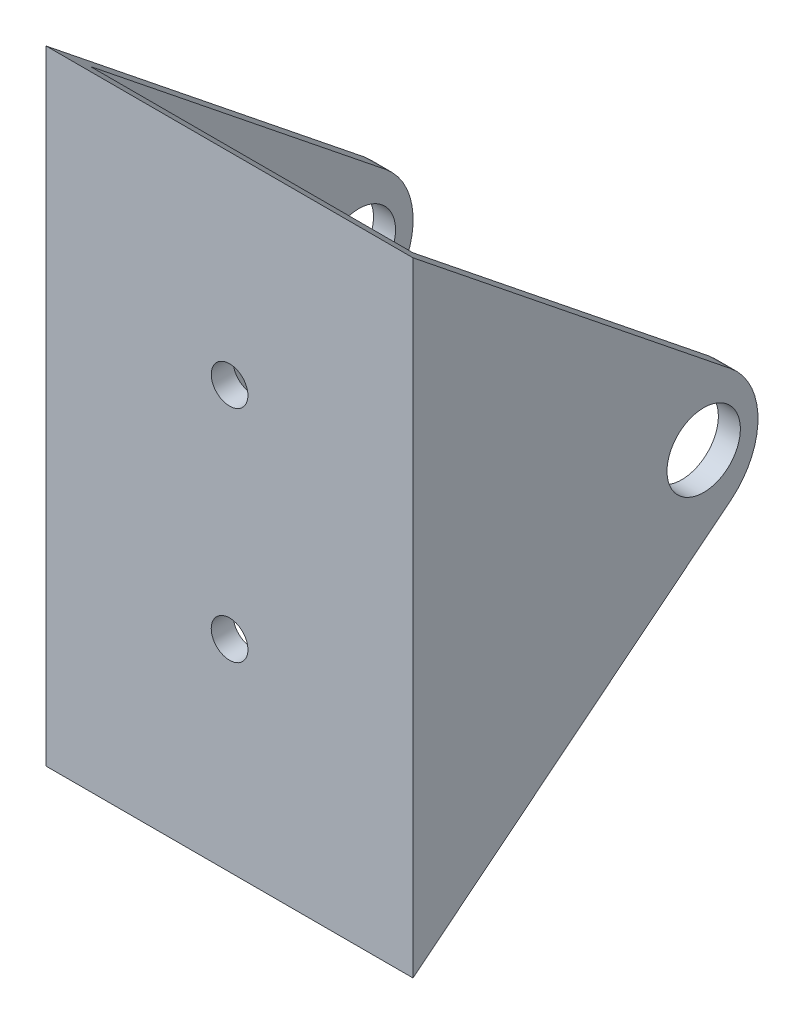
ISO-10303-21;
HEADER;
FILE_DESCRIPTION(('STEP AP214'),'2;1');
FILE_NAME('part.step','',(''),(''),'','','');
FILE_SCHEMA(('AUTOMOTIVE_DESIGN { 1 0 10303 214 1 1 1 1 }'));
ENDSEC;
DATA;
#1=APPLICATION_CONTEXT('core data for automotive mechanical design processes');
#2=APPLICATION_PROTOCOL_DEFINITION('international standard','automotive_design',2000,#1);
#3=PRODUCT_CONTEXT('',#1,'mechanical');
#4=PRODUCT('Part','Part','',(#3));
#5=PRODUCT_RELATED_PRODUCT_CATEGORY('part','',(#4));
#6=PRODUCT_DEFINITION_FORMATION('','',#4);
#7=PRODUCT_DEFINITION_CONTEXT('part definition',#1,'design');
#8=PRODUCT_DEFINITION('design','',#6,#7);
#9=PRODUCT_DEFINITION_SHAPE('','',#8);
#10=(LENGTH_UNIT() NAMED_UNIT(*) SI_UNIT(.MILLI.,.METRE.));
#11=(NAMED_UNIT(*) PLANE_ANGLE_UNIT() SI_UNIT($,.RADIAN.));
#12=(NAMED_UNIT(*) SI_UNIT($,.STERADIAN.) SOLID_ANGLE_UNIT());
#13=UNCERTAINTY_MEASURE_WITH_UNIT(LENGTH_MEASURE(1.E-05),#10,'distance_accuracy_value','');
#14=(GEOMETRIC_REPRESENTATION_CONTEXT(3) GLOBAL_UNCERTAINTY_ASSIGNED_CONTEXT((#13)) GLOBAL_UNIT_ASSIGNED_CONTEXT((#10,
#11,#12)) REPRESENTATION_CONTEXT('',''));
#15=CARTESIAN_POINT('',(0.,0.,0.));
#16=DIRECTION('',(0.,0.,1.));
#17=DIRECTION('',(1.,0.,0.));
#18=AXIS2_PLACEMENT_3D('',#15,#16,#17);
#19=CARTESIAN_POINT('',(0.,0.,0.));
#20=DIRECTION('',(0.,0.,1.));
#21=DIRECTION('',(1.,0.,0.));
#22=AXIS2_PLACEMENT_3D('',#19,#20,#21);
#23=PLANE('',#22);
#24=CARTESIAN_POINT('',(0.,15.,0.));
#25=DIRECTION('',(0.,0.,1.));
#26=DIRECTION('',(1.,0.,0.));
#27=AXIS2_PLACEMENT_3D('',#24,#25,#26);
#28=CIRCLE('',#27,2.5);
#29=CARTESIAN_POINT('',(2.5,15.,0.));
#30=VERTEX_POINT('',#29);
#31=EDGE_CURVE('E214',#30,#30,#28,.T.);
#32=ORIENTED_EDGE('',*,*,#31,.T.);
#33=EDGE_LOOP('',(#32));
#34=FACE_BOUND('',#33,.T.);
#35=CARTESIAN_POINT('',(0.,-15.,0.));
#36=DIRECTION('',(0.,0.,1.));
#37=DIRECTION('',(1.,0.,0.));
#38=AXIS2_PLACEMENT_3D('',#35,#36,#37);
#39=CIRCLE('',#38,2.5);
#40=CARTESIAN_POINT('',(2.50000000000001,-15.,0.));
#41=VERTEX_POINT('',#40);
#42=EDGE_CURVE('E219',#41,#41,#39,.T.);
#43=ORIENTED_EDGE('',*,*,#42,.T.);
#44=EDGE_LOOP('',(#43));
#45=FACE_BOUND('',#44,.T.);
#46=DIRECTION('',(-1.,0.,0.));
#47=VECTOR('',#46,1.);
#48=CARTESIAN_POINT('',(0.,40.0943396226415,0.));
#49=LINE('',#48,#47);
#50=CARTESIAN_POINT('',(22.,40.0943396226415,0.));
#51=VERTEX_POINT('',#50);
#52=CARTESIAN_POINT('',(-22.,40.0943396226415,0.));
#53=VERTEX_POINT('',#52);
#54=EDGE_CURVE('E174',#51,#53,#49,.T.);
#55=ORIENTED_EDGE('',*,*,#54,.F.);
#56=DIRECTION('',(0.,1.,0.));
#57=VECTOR('',#56,1.);
#58=CARTESIAN_POINT('',(22.,-42.5,0.));
#59=LINE('',#58,#57);
#60=CARTESIAN_POINT('',(22.,-40.0943396226415,0.));
#61=VERTEX_POINT('',#60);
#62=EDGE_CURVE('E190',#61,#51,#59,.T.);
#63=ORIENTED_EDGE('',*,*,#62,.F.);
#64=DIRECTION('',(1.,0.,0.));
#65=VECTOR('',#64,1.);
#66=CARTESIAN_POINT('',(0.,-40.0943396226415,0.));
#67=LINE('',#66,#65);
#68=CARTESIAN_POINT('',(-22.,-40.0943396226415,0.));
#69=VERTEX_POINT('',#68);
#70=EDGE_CURVE('E183',#69,#61,#67,.T.);
#71=ORIENTED_EDGE('',*,*,#70,.F.);
#72=DIRECTION('',(0.,-1.,0.));
#73=VECTOR('',#72,1.);
#74=CARTESIAN_POINT('',(-22.,42.5,0.));
#75=LINE('',#74,#73);
#76=EDGE_CURVE('E188',#53,#69,#75,.T.);
#77=ORIENTED_EDGE('',*,*,#76,.F.);
#78=EDGE_LOOP('',(#55,#63,#71,#77));
#79=FACE_BOUND('',#78,.T.);
#80=ADVANCED_FACE('F55',(#34,#45,#79),#23,.F.);
#81=CARTESIAN_POINT('',(25.,42.5,3.));
#82=DIRECTION('',(-1.,0.,0.));
#83=DIRECTION('',(0.,-1.,0.));
#84=AXIS2_PLACEMENT_3D('',#81,#82,#83);
#85=PLANE('',#84);
#86=CARTESIAN_POINT('',(25.,0.,-36.6147540574796));
#87=DIRECTION('',(1.,0.,0.));
#88=DIRECTION('',(0.,1.,0.));
#89=AXIS2_PLACEMENT_3D('',#86,#87,#88);
#90=CIRCLE('',#89,5.);
#91=CARTESIAN_POINT('',(25.,5.,-36.6147540574796));
#92=VERTEX_POINT('',#91);
#93=EDGE_CURVE('E211',#92,#92,#90,.T.);
#94=ORIENTED_EDGE('',*,*,#93,.F.);
#95=EDGE_LOOP('',(#94));
#96=FACE_BOUND('',#95,.T.);
#97=DIRECTION('',(0.,0.625592184650773,-0.780150253799788));
#98=VECTOR('',#97,1.);
#99=CARTESIAN_POINT('',(25.,-24.4027950815232,-19.5682790748063));
#100=LINE('',#99,#98);
#101=CARTESIAN_POINT('',(25.,-42.5,3.));
#102=VERTEX_POINT('',#101);
#103=CARTESIAN_POINT('',(25.,-7.80150253799787,-40.2710674232027));
#104=VERTEX_POINT('',#103);
#105=EDGE_CURVE('E165',#102,#104,#100,.T.);
#106=ORIENTED_EDGE('',*,*,#105,.T.);
#107=CARTESIAN_POINT('',(25.,0.,-34.0151455766949));
#108=DIRECTION('',(-1.,0.,0.));
#109=DIRECTION('',(0.,-1.,0.));
#110=AXIS2_PLACEMENT_3D('',#107,#108,#109);
#111=CIRCLE('',#110,10.);
#112=CARTESIAN_POINT('',(25.,7.80150253799787,-40.2710674232027));
#113=VERTEX_POINT('',#112);
#114=EDGE_CURVE('E64',#104,#113,#111,.F.);
#115=ORIENTED_EDGE('',*,*,#114,.T.);
#116=DIRECTION('',(0.,0.625592184650773,0.780150253799788));
#117=VECTOR('',#116,1.);
#118=CARTESIAN_POINT('',(25.,24.4027950815232,-19.5682790748063));
#119=LINE('',#118,#117);
#120=CARTESIAN_POINT('',(25.,42.5,3.));
#121=VERTEX_POINT('',#120);
#122=EDGE_CURVE('E127',#113,#121,#119,.T.);
#123=ORIENTED_EDGE('',*,*,#122,.T.);
#124=DIRECTION('',(0.,1.,0.));
#125=VECTOR('',#124,1.);
#126=CARTESIAN_POINT('',(25.,42.5,3.));
#127=LINE('',#126,#125);
#128=EDGE_CURVE('E135',#102,#121,#127,.T.);
#129=ORIENTED_EDGE('',*,*,#128,.F.);
#130=EDGE_LOOP('',(#106,#115,#123,#129));
#131=FACE_BOUND('',#130,.T.);
#132=ADVANCED_FACE('F245',(#96,#131),#85,.F.);
#133=CARTESIAN_POINT('',(-25.,42.5,3.));
#134=DIRECTION('',(1.,0.,0.));
#135=DIRECTION('',(0.,1.,0.));
#136=AXIS2_PLACEMENT_3D('',#133,#134,#135);
#137=PLANE('',#136);
#138=CARTESIAN_POINT('',(-25.,0.,-36.6147540574796));
#139=DIRECTION('',(1.,0.,0.));
#140=DIRECTION('',(0.,1.,0.));
#141=AXIS2_PLACEMENT_3D('',#138,#139,#140);
#142=CIRCLE('',#141,5.);
#143=CARTESIAN_POINT('',(-25.,4.99999999999999,-36.6147540574796));
#144=VERTEX_POINT('',#143);
#145=EDGE_CURVE('E209',#144,#144,#142,.T.);
#146=ORIENTED_EDGE('',*,*,#145,.T.);
#147=EDGE_LOOP('',(#146));
#148=FACE_BOUND('',#147,.T.);
#149=DIRECTION('',(0.,0.625592184650773,0.780150253799788));
#150=VECTOR('',#149,1.);
#151=CARTESIAN_POINT('',(-25.,24.4027950815232,-19.5682790748063));
#152=LINE('',#151,#150);
#153=CARTESIAN_POINT('',(-25.,7.80150253799787,-40.2710674232027));
#154=VERTEX_POINT('',#153);
#155=CARTESIAN_POINT('',(-25.,42.5,3.));
#156=VERTEX_POINT('',#155);
#157=EDGE_CURVE('E118',#154,#156,#152,.T.);
#158=ORIENTED_EDGE('',*,*,#157,.F.);
#159=CARTESIAN_POINT('',(-25.,0.,-34.0151455766949));
#160=DIRECTION('',(1.,0.,0.));
#161=DIRECTION('',(0.,1.,0.));
#162=AXIS2_PLACEMENT_3D('',#159,#160,#161);
#163=CIRCLE('',#162,10.);
#164=CARTESIAN_POINT('',(-25.,-7.80150253799787,-40.2710674232027));
#165=VERTEX_POINT('',#164);
#166=EDGE_CURVE('E157',#154,#165,#163,.F.);
#167=ORIENTED_EDGE('',*,*,#166,.T.);
#168=DIRECTION('',(0.,0.625592184650773,-0.780150253799788));
#169=VECTOR('',#168,1.);
#170=CARTESIAN_POINT('',(-25.,-24.4027950815232,-19.5682790748063));
#171=LINE('',#170,#169);
#172=CARTESIAN_POINT('',(-25.,-42.5,3.));
#173=VERTEX_POINT('',#172);
#174=EDGE_CURVE('E140',#173,#165,#171,.T.);
#175=ORIENTED_EDGE('',*,*,#174,.F.);
#176=DIRECTION('',(0.,-1.,0.));
#177=VECTOR('',#176,1.);
#178=CARTESIAN_POINT('',(-25.,42.5,3.));
#179=LINE('',#178,#177);
#180=EDGE_CURVE('E133',#156,#173,#179,.T.);
#181=ORIENTED_EDGE('',*,*,#180,.F.);
#182=EDGE_LOOP('',(#158,#167,#175,#181));
#183=FACE_BOUND('',#182,.T.);
#184=ADVANCED_FACE('F138',(#148,#183),#137,.F.);
#185=CARTESIAN_POINT('',(22.,-42.5,-50.));
#186=DIRECTION('',(1.,0.,0.));
#187=DIRECTION('',(0.,1.,0.));
#188=AXIS2_PLACEMENT_3D('',#185,#186,#187);
#189=PLANE('',#188);
#190=CARTESIAN_POINT('',(22.,0.,-36.6147540574796));
#191=DIRECTION('',(1.,0.,0.));
#192=DIRECTION('',(0.,1.,0.));
#193=AXIS2_PLACEMENT_3D('',#190,#191,#192);
#194=CIRCLE('',#193,5.);
#195=CARTESIAN_POINT('',(22.,5.,-36.6147540574796));
#196=VERTEX_POINT('',#195);
#197=EDGE_CURVE('E203',#196,#196,#194,.T.);
#198=ORIENTED_EDGE('',*,*,#197,.T.);
#199=EDGE_LOOP('',(#198));
#200=FACE_BOUND('',#199,.T.);
#201=DIRECTION('',(0.,0.625592184650773,0.780150253799788));
#202=VECTOR('',#201,1.);
#203=CARTESIAN_POINT('',(22.,-16.6330372135854,-70.7423758192947));
#204=LINE('',#203,#202);
#205=CARTESIAN_POINT('',(22.,7.80150253799788,-40.2710674232027));
#206=VERTEX_POINT('',#205);
#207=EDGE_CURVE('E176',#206,#51,#204,.T.);
#208=ORIENTED_EDGE('',*,*,#207,.F.);
#209=CARTESIAN_POINT('',(22.,0.,-34.0151455766949));
#210=DIRECTION('',(1.,0.,0.));
#211=DIRECTION('',(0.,1.,0.));
#212=AXIS2_PLACEMENT_3D('',#209,#210,#211);
#213=CIRCLE('',#212,10.);
#214=CARTESIAN_POINT('',(22.,-7.80150253799787,-40.2710674232027));
#215=VERTEX_POINT('',#214);
#216=EDGE_CURVE('E12',#206,#215,#213,.F.);
#217=ORIENTED_EDGE('',*,*,#216,.T.);
#218=DIRECTION('',(0.,0.625592184650773,-0.780150253799788));
#219=VECTOR('',#218,1.);
#220=CARTESIAN_POINT('',(22.,-16.6330372135854,-29.2576241807053));
#221=LINE('',#220,#219);
#222=EDGE_CURVE('E185',#61,#215,#221,.T.);
#223=ORIENTED_EDGE('',*,*,#222,.F.);
#224=ORIENTED_EDGE('',*,*,#62,.T.);
#225=EDGE_LOOP('',(#208,#217,#223,#224));
#226=FACE_BOUND('',#225,.T.);
#227=ADVANCED_FACE('F196',(#200,#226),#189,.F.);
#228=CARTESIAN_POINT('',(-22.,42.5,-50.));
#229=DIRECTION('',(-1.,0.,0.));
#230=DIRECTION('',(0.,-1.,0.));
#231=AXIS2_PLACEMENT_3D('',#228,#229,#230);
#232=PLANE('',#231);
#233=CARTESIAN_POINT('',(-22.,0.,-36.6147540574796));
#234=DIRECTION('',(-1.,0.,0.));
#235=DIRECTION('',(0.,-1.,0.));
#236=AXIS2_PLACEMENT_3D('',#233,#234,#235);
#237=CIRCLE('',#236,5.);
#238=CARTESIAN_POINT('',(-22.,-5.,-36.6147540574796));
#239=VERTEX_POINT('',#238);
#240=EDGE_CURVE('E59',#239,#239,#237,.T.);
#241=ORIENTED_EDGE('',*,*,#240,.T.);
#242=EDGE_LOOP('',(#241));
#243=FACE_BOUND('',#242,.T.);
#244=DIRECTION('',(0.,-0.625592184650773,0.780150253799788));
#245=VECTOR('',#244,1.);
#246=CARTESIAN_POINT('',(-22.,16.6330372135854,-70.7423758192947));
#247=LINE('',#246,#245);
#248=CARTESIAN_POINT('',(-22.,-7.80150253799788,-40.2710674232026));
#249=VERTEX_POINT('',#248);
#250=EDGE_CURVE('E164',#249,#69,#247,.T.);
#251=ORIENTED_EDGE('',*,*,#250,.F.);
#252=CARTESIAN_POINT('',(-22.,0.,-34.0151455766949));
#253=DIRECTION('',(-1.,0.,0.));
#254=DIRECTION('',(0.,-1.,0.));
#255=AXIS2_PLACEMENT_3D('',#252,#253,#254);
#256=CIRCLE('',#255,10.);
#257=CARTESIAN_POINT('',(-22.,7.80150253799787,-40.2710674232027));
#258=VERTEX_POINT('',#257);
#259=EDGE_CURVE('E152',#249,#258,#256,.F.);
#260=ORIENTED_EDGE('',*,*,#259,.T.);
#261=DIRECTION('',(0.,-0.625592184650773,-0.780150253799788));
#262=VECTOR('',#261,1.);
#263=CARTESIAN_POINT('',(-22.,16.6330372135854,-29.2576241807053));
#264=LINE('',#263,#262);
#265=EDGE_CURVE('E126',#53,#258,#264,.T.);
#266=ORIENTED_EDGE('',*,*,#265,.F.);
#267=ORIENTED_EDGE('',*,*,#76,.T.);
#268=EDGE_LOOP('',(#251,#260,#266,#267));
#269=FACE_BOUND('',#268,.T.);
#270=ADVANCED_FACE('F170',(#243,#269),#232,.F.);
#271=CARTESIAN_POINT('',(0.,0.,3.));
#272=DIRECTION('',(0.,0.,1.));
#273=DIRECTION('',(1.,0.,0.));
#274=AXIS2_PLACEMENT_3D('',#271,#272,#273);
#275=PLANE('',#274);
#276=CARTESIAN_POINT('',(0.,15.,3.));
#277=DIRECTION('',(0.,0.,1.));
#278=DIRECTION('',(1.,0.,0.));
#279=AXIS2_PLACEMENT_3D('',#276,#277,#278);
#280=CIRCLE('',#279,2.5);
#281=CARTESIAN_POINT('',(2.5,15.,3.));
#282=VERTEX_POINT('',#281);
#283=EDGE_CURVE('E222',#282,#282,#280,.T.);
#284=ORIENTED_EDGE('',*,*,#283,.F.);
#285=EDGE_LOOP('',(#284));
#286=FACE_BOUND('',#285,.T.);
#287=CARTESIAN_POINT('',(0.,-15.,3.));
#288=DIRECTION('',(0.,0.,1.));
#289=DIRECTION('',(-1.,0.,0.));
#290=AXIS2_PLACEMENT_3D('',#287,#288,#289);
#291=CIRCLE('',#290,2.5);
#292=CARTESIAN_POINT('',(-2.49999999999999,-15.,3.));
#293=VERTEX_POINT('',#292);
#294=EDGE_CURVE('E223',#293,#293,#291,.T.);
#295=ORIENTED_EDGE('',*,*,#294,.F.);
#296=EDGE_LOOP('',(#295));
#297=FACE_BOUND('',#296,.T.);
#298=ORIENTED_EDGE('',*,*,#128,.T.);
#299=DIRECTION('',(-1.,0.,0.));
#300=VECTOR('',#299,1.);
#301=CARTESIAN_POINT('',(-25.,42.5,3.));
#302=LINE('',#301,#300);
#303=EDGE_CURVE('E121',#121,#156,#302,.T.);
#304=ORIENTED_EDGE('',*,*,#303,.T.);
#305=ORIENTED_EDGE('',*,*,#180,.T.);
#306=DIRECTION('',(1.,0.,0.));
#307=VECTOR('',#306,1.);
#308=CARTESIAN_POINT('',(-25.,-42.5,3.));
#309=LINE('',#308,#307);
#310=EDGE_CURVE('E141',#173,#102,#309,.T.);
#311=ORIENTED_EDGE('',*,*,#310,.T.);
#312=EDGE_LOOP('',(#298,#304,#305,#311));
#313=FACE_BOUND('',#312,.T.);
#314=ADVANCED_FACE('F131',(#286,#297,#313),#275,.T.);
#315=CARTESIAN_POINT('',(-25.,-24.4027950815232,-19.5682790748063));
#316=DIRECTION('',(0.,-0.780150253799788,-0.625592184650773));
#317=DIRECTION('',(0.,0.625592184650773,-0.780150253799788));
#318=AXIS2_PLACEMENT_3D('',#315,#316,#317);
#319=PLANE('',#318);
#320=ORIENTED_EDGE('',*,*,#174,.T.);
#321=DIRECTION('',(1.,0.,0.));
#322=VECTOR('',#321,1.);
#323=CARTESIAN_POINT('',(-25.,-7.80150253799788,-40.2710674232026));
#324=LINE('',#323,#322);
#325=EDGE_CURVE('E149',#165,#249,#324,.T.);
#326=ORIENTED_EDGE('',*,*,#325,.T.);
#327=ORIENTED_EDGE('',*,*,#250,.T.);
#328=ORIENTED_EDGE('',*,*,#70,.T.);
#329=ORIENTED_EDGE('',*,*,#222,.T.);
#330=DIRECTION('',(1.,0.,0.));
#331=VECTOR('',#330,1.);
#332=CARTESIAN_POINT('',(-25.,-7.80150253799788,-40.2710674232026));
#333=LINE('',#332,#331);
#334=EDGE_CURVE('E143',#215,#104,#333,.T.);
#335=ORIENTED_EDGE('',*,*,#334,.T.);
#336=ORIENTED_EDGE('',*,*,#105,.F.);
#337=ORIENTED_EDGE('',*,*,#310,.F.);
#338=EDGE_LOOP('',(#320,#326,#327,#328,#329,#335,#336,#337));
#339=FACE_BOUND('',#338,.T.);
#340=ADVANCED_FACE('F162',(#339),#319,.T.);
#341=CARTESIAN_POINT('',(-25.,24.4027950815232,-19.5682790748063));
#342=DIRECTION('',(0.,0.780150253799788,-0.625592184650773));
#343=DIRECTION('',(0.,0.625592184650773,0.780150253799788));
#344=AXIS2_PLACEMENT_3D('',#341,#342,#343);
#345=PLANE('',#344);
#346=ORIENTED_EDGE('',*,*,#265,.T.);
#347=DIRECTION('',(1.,0.,0.));
#348=VECTOR('',#347,1.);
#349=CARTESIAN_POINT('',(-25.,7.80150253799787,-40.2710674232026));
#350=LINE('',#349,#348);
#351=EDGE_CURVE('E78',#258,#154,#350,.F.);
#352=ORIENTED_EDGE('',*,*,#351,.T.);
#353=ORIENTED_EDGE('',*,*,#157,.T.);
#354=ORIENTED_EDGE('',*,*,#303,.F.);
#355=ORIENTED_EDGE('',*,*,#122,.F.);
#356=DIRECTION('',(1.,0.,0.));
#357=VECTOR('',#356,1.);
#358=CARTESIAN_POINT('',(-25.,7.80150253799787,-40.2710674232026));
#359=LINE('',#358,#357);
#360=EDGE_CURVE('E154',#113,#206,#359,.F.);
#361=ORIENTED_EDGE('',*,*,#360,.T.);
#362=ORIENTED_EDGE('',*,*,#207,.T.);
#363=ORIENTED_EDGE('',*,*,#54,.T.);
#364=EDGE_LOOP('',(#346,#352,#353,#354,#355,#361,#362,#363));
#365=FACE_BOUND('',#364,.T.);
#366=ADVANCED_FACE('F120',(#365),#345,.T.);
#367=CARTESIAN_POINT('',(-25.,0.,-34.0151455766949));
#368=DIRECTION('',(1.,0.,0.));
#369=DIRECTION('',(0.,1.,0.));
#370=AXIS2_PLACEMENT_3D('',#367,#368,#369);
#371=CYLINDRICAL_SURFACE('',#370,10.);
#372=ORIENTED_EDGE('',*,*,#166,.F.);
#373=ORIENTED_EDGE('',*,*,#351,.F.);
#374=ORIENTED_EDGE('',*,*,#259,.F.);
#375=ORIENTED_EDGE('',*,*,#325,.F.);
#376=EDGE_LOOP('',(#372,#373,#374,#375));
#377=FACE_BOUND('',#376,.T.);
#378=ADVANCED_FACE('F167',(#377),#371,.T.);
#379=CARTESIAN_POINT('',(-25.,0.,-34.0151455766949));
#380=DIRECTION('',(1.,0.,0.));
#381=DIRECTION('',(0.,1.,0.));
#382=AXIS2_PLACEMENT_3D('',#379,#380,#381);
#383=CYLINDRICAL_SURFACE('',#382,10.);
#384=ORIENTED_EDGE('',*,*,#216,.F.);
#385=ORIENTED_EDGE('',*,*,#360,.F.);
#386=ORIENTED_EDGE('',*,*,#114,.F.);
#387=ORIENTED_EDGE('',*,*,#334,.F.);
#388=EDGE_LOOP('',(#384,#385,#386,#387));
#389=FACE_BOUND('',#388,.T.);
#390=ADVANCED_FACE('F57',(#389),#383,.T.);
#391=CARTESIAN_POINT('',(-25.,0.,-36.6147540574796));
#392=DIRECTION('',(1.,0.,0.));
#393=DIRECTION('',(0.,1.,0.));
#394=AXIS2_PLACEMENT_3D('',#391,#392,#393);
#395=CYLINDRICAL_SURFACE('',#394,5.);
#396=ORIENTED_EDGE('',*,*,#145,.F.);
#397=EDGE_LOOP('',(#396));
#398=FACE_BOUND('',#397,.T.);
#399=ORIENTED_EDGE('',*,*,#240,.F.);
#400=EDGE_LOOP('',(#399));
#401=FACE_BOUND('',#400,.T.);
#402=ADVANCED_FACE('F262',(#398,#401),#395,.F.);
#403=ORIENTED_EDGE('',*,*,#93,.T.);
#404=EDGE_LOOP('',(#403));
#405=FACE_BOUND('',#404,.T.);
#406=ORIENTED_EDGE('',*,*,#197,.F.);
#407=EDGE_LOOP('',(#406));
#408=FACE_BOUND('',#407,.T.);
#409=ADVANCED_FACE('F240',(#405,#408),#395,.F.);
#410=CARTESIAN_POINT('',(0.,-15.,-17.));
#411=DIRECTION('',(0.,0.,1.));
#412=DIRECTION('',(1.,0.,0.));
#413=AXIS2_PLACEMENT_3D('',#410,#411,#412);
#414=CYLINDRICAL_SURFACE('',#413,2.5);
#415=ORIENTED_EDGE('',*,*,#294,.T.);
#416=EDGE_LOOP('',(#415));
#417=FACE_BOUND('',#416,.T.);
#418=ORIENTED_EDGE('',*,*,#42,.F.);
#419=EDGE_LOOP('',(#418));
#420=FACE_BOUND('',#419,.T.);
#421=ADVANCED_FACE('F237',(#417,#420),#414,.F.);
#422=CARTESIAN_POINT('',(0.,15.,-17.));
#423=DIRECTION('',(0.,0.,1.));
#424=DIRECTION('',(1.,0.,0.));
#425=AXIS2_PLACEMENT_3D('',#422,#423,#424);
#426=CYLINDRICAL_SURFACE('',#425,2.5);
#427=ORIENTED_EDGE('',*,*,#283,.T.);
#428=EDGE_LOOP('',(#427));
#429=FACE_BOUND('',#428,.T.);
#430=ORIENTED_EDGE('',*,*,#31,.F.);
#431=EDGE_LOOP('',(#430));
#432=FACE_BOUND('',#431,.T.);
#433=ADVANCED_FACE('F229',(#429,#432),#426,.F.);
#434=CLOSED_SHELL('',(#80,#132,#184,#227,#270,#314,#340,#366,#378,#390,#402,#409,#421,#433));
#435=MANIFOLD_SOLID_BREP('B2',#434);
#436=ADVANCED_BREP_SHAPE_REPRESENTATION('',(#18,#435),#14);
#437=SHAPE_DEFINITION_REPRESENTATION(#9,#436);
ENDSEC;
END-ISO-10303-21;
